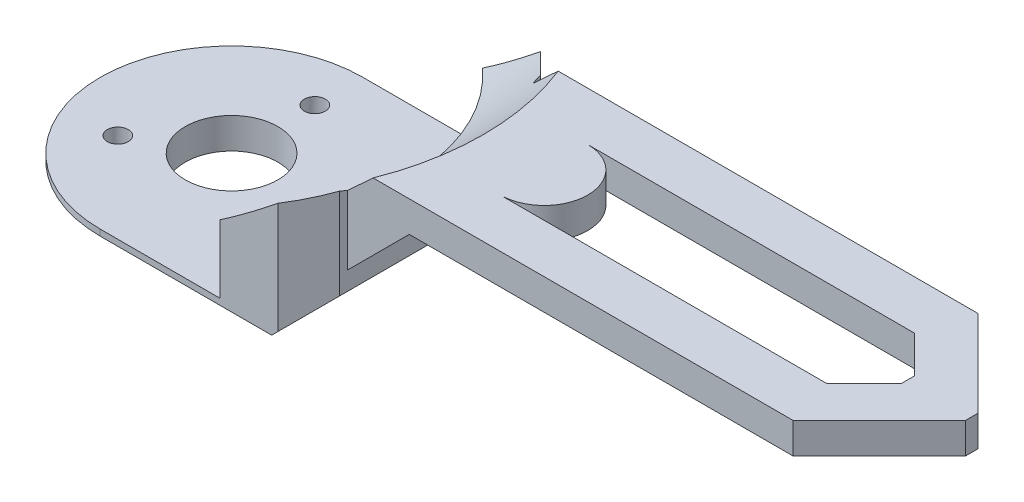
ISO-10303-21;
HEADER;
FILE_DESCRIPTION(('STEP AP214'),'2;1');
FILE_NAME('part.step','',(''),(''),'','','');
FILE_SCHEMA(('AUTOMOTIVE_DESIGN { 1 0 10303 214 1 1 1 1 }'));
ENDSEC;
DATA;
#1=APPLICATION_CONTEXT('core data for automotive mechanical design processes');
#2=APPLICATION_PROTOCOL_DEFINITION('international standard','automotive_design',2000,#1);
#3=PRODUCT_CONTEXT('',#1,'mechanical');
#4=PRODUCT('Part','Part','',(#3));
#5=PRODUCT_RELATED_PRODUCT_CATEGORY('part','',(#4));
#6=PRODUCT_DEFINITION_FORMATION('','',#4);
#7=PRODUCT_DEFINITION_CONTEXT('part definition',#1,'design');
#8=PRODUCT_DEFINITION('design','',#6,#7);
#9=PRODUCT_DEFINITION_SHAPE('','',#8);
#10=(LENGTH_UNIT() NAMED_UNIT(*) SI_UNIT(.MILLI.,.METRE.));
#11=(NAMED_UNIT(*) PLANE_ANGLE_UNIT() SI_UNIT($,.RADIAN.));
#12=(NAMED_UNIT(*) SI_UNIT($,.STERADIAN.) SOLID_ANGLE_UNIT());
#13=UNCERTAINTY_MEASURE_WITH_UNIT(LENGTH_MEASURE(1.E-05),#10,'distance_accuracy_value','');
#14=(GEOMETRIC_REPRESENTATION_CONTEXT(3) GLOBAL_UNCERTAINTY_ASSIGNED_CONTEXT((#13)) GLOBAL_UNIT_ASSIGNED_CONTEXT((#10,
#11,#12)) REPRESENTATION_CONTEXT('',''));
#15=CARTESIAN_POINT('',(0.,0.,0.));
#16=DIRECTION('',(0.,0.,1.));
#17=DIRECTION('',(1.,0.,0.));
#18=AXIS2_PLACEMENT_3D('',#15,#16,#17);
#19=CARTESIAN_POINT('',(33.8,5.,-21.3));
#20=DIRECTION('',(-1.,0.,0.));
#21=DIRECTION('',(0.,0.,1.));
#22=AXIS2_PLACEMENT_3D('',#19,#20,#21);
#23=PLANE('',#22);
#24=CARTESIAN_POINT('',(33.8,24.1789129099275,15.));
#25=CARTESIAN_POINT('',(33.8,24.3973295348672,15.5384090427307));
#26=CARTESIAN_POINT('',(33.8,24.6241329483371,16.0733646535301));
#27=CARTESIAN_POINT('',(33.8,25.0927755995893,17.1362230111643));
#28=CARTESIAN_POINT('',(33.8,25.3346045241524,17.6641302999805));
#29=CARTESIAN_POINT('',(33.8,25.8318402615375,18.7134320844225));
#30=CARTESIAN_POINT('',(33.8,26.0872459221836,19.2348271280804));
#31=CARTESIAN_POINT('',(33.8,26.6104771277259,20.2717980670367));
#32=CARTESIAN_POINT('',(33.8,26.8783109907833,20.7873697692283));
#33=CARTESIAN_POINT('',(33.8000000000001,27.1515957128123,21.3));
#34=B_SPLINE_CURVE_WITH_KNOTS('',3,(#24,#25,#26,#27,#28,#29,#30,#31,#32,#33),.UNSPECIFIED.,.F.,
.F.,(4,2,2,2,4),(0.,1.74293635285607,3.48468932815153,5.22629472660163,6.96908308081715),.UNSPECIFIED.);
#35=CARTESIAN_POINT('',(33.8,24.1789129099275,15.));
#36=VERTEX_POINT('',#35);
#37=CARTESIAN_POINT('',(33.8,24.7250582944251,16.3));
#38=VERTEX_POINT('',#37);
#39=EDGE_CURVE('E464',#36,#38,#34,.T.);
#40=ORIENTED_EDGE('',*,*,#39,.T.);
#41=DIRECTION('',(0.,-1.,0.));
#42=VECTOR('',#41,1.);
#43=CARTESIAN_POINT('',(33.8,4.99999999999999,16.3));
#44=LINE('',#43,#42);
#45=CARTESIAN_POINT('',(33.8,10.,16.3));
#46=VERTEX_POINT('',#45);
#47=EDGE_CURVE('E399',#38,#46,#44,.T.);
#48=ORIENTED_EDGE('',*,*,#47,.T.);
#49=DIRECTION('',(0.,0.,-1.));
#50=VECTOR('',#49,1.);
#51=CARTESIAN_POINT('',(33.8,10.,-21.3));
#52=LINE('',#51,#50);
#53=CARTESIAN_POINT('',(33.8,10.,-16.3));
#54=VERTEX_POINT('',#53);
#55=EDGE_CURVE('E321',#46,#54,#52,.T.);
#56=ORIENTED_EDGE('',*,*,#55,.T.);
#57=DIRECTION('',(0.,1.,0.));
#58=VECTOR('',#57,1.);
#59=CARTESIAN_POINT('',(33.8,5.,-16.3));
#60=LINE('',#59,#58);
#61=CARTESIAN_POINT('',(33.8,24.7250582944251,-16.3));
#62=VERTEX_POINT('',#61);
#63=EDGE_CURVE('E391',#54,#62,#60,.T.);
#64=ORIENTED_EDGE('',*,*,#63,.T.);
#65=CARTESIAN_POINT('',(33.8,27.1515957128123,-21.3));
#66=CARTESIAN_POINT('',(33.8,26.8783109907833,-20.7873697692283));
#67=CARTESIAN_POINT('',(33.8,26.6104771277259,-20.2717980670367));
#68=CARTESIAN_POINT('',(33.8,26.0872459221836,-19.2348271280805));
#69=CARTESIAN_POINT('',(33.8,25.8318402615375,-18.7134320844226));
#70=CARTESIAN_POINT('',(33.8,25.3346045241524,-17.6641302999805));
#71=CARTESIAN_POINT('',(33.8,25.0927755995893,-17.1362230111643));
#72=CARTESIAN_POINT('',(33.8,24.6241329483371,-16.0733646535302));
#73=CARTESIAN_POINT('',(33.8,24.3973295348672,-15.5384090427308));
#74=CARTESIAN_POINT('',(33.8,24.1789129099275,-15.));
#75=B_SPLINE_CURVE_WITH_KNOTS('',3,(#65,#66,#67,#68,#69,#70,#71,#72,#73,#74),.UNSPECIFIED.,.F.,
.F.,(4,2,2,2,4),(0.,1.74278835421552,3.48439375266562,5.22614672796108,6.96908308081715),.UNSPECIFIED.);
#76=CARTESIAN_POINT('',(33.8,24.1789129099275,-15.));
#77=VERTEX_POINT('',#76);
#78=EDGE_CURVE('E360',#62,#77,#75,.T.);
#79=ORIENTED_EDGE('',*,*,#78,.T.);
#80=DIRECTION('',(0.,1.,0.));
#81=VECTOR('',#80,1.);
#82=CARTESIAN_POINT('',(33.8,28.,-15.));
#83=LINE('',#82,#81);
#84=CARTESIAN_POINT('',(33.8,13.,-15.));
#85=VERTEX_POINT('',#84);
#86=EDGE_CURVE('E231',#85,#77,#83,.T.);
#87=ORIENTED_EDGE('',*,*,#86,.F.);
#88=DIRECTION('',(0.,0.,1.));
#89=VECTOR('',#88,1.);
#90=CARTESIAN_POINT('',(33.8,13.,15.));
#91=LINE('',#90,#89);
#92=CARTESIAN_POINT('',(33.8,13.,15.));
#93=VERTEX_POINT('',#92);
#94=EDGE_CURVE('E312',#85,#93,#91,.T.);
#95=ORIENTED_EDGE('',*,*,#94,.T.);
#96=DIRECTION('',(0.,-1.,0.));
#97=VECTOR('',#96,1.);
#98=CARTESIAN_POINT('',(33.8,28.,15.));
#99=LINE('',#98,#97);
#100=EDGE_CURVE('E250',#36,#93,#99,.T.);
#101=ORIENTED_EDGE('',*,*,#100,.F.);
#102=EDGE_LOOP('',(#40,#48,#56,#64,#79,#87,#95,#101));
#103=FACE_BOUND('',#102,.T.);
#104=ADVANCED_FACE('F42',(#103),#23,.F.);
#105=CARTESIAN_POINT('',(0.,5.,0.));
#106=DIRECTION('',(0.,1.,0.));
#107=DIRECTION('',(0.,0.,1.));
#108=AXIS2_PLACEMENT_3D('',#105,#106,#107);
#109=PLANE('',#108);
#110=CARTESIAN_POINT('',(-11.6913429510895,5.00000000000002,6.75000000000021));
#111=DIRECTION('',(0.,1.,0.));
#112=DIRECTION('',(0.,0.,1.));
#113=AXIS2_PLACEMENT_3D('',#110,#111,#112);
#114=CIRCLE('',#113,1.7);
#115=CARTESIAN_POINT('',(-11.6913429510895,5.00000000000002,8.45000000000021));
#116=VERTEX_POINT('',#115);
#117=EDGE_CURVE('E274',#116,#116,#114,.T.);
#118=ORIENTED_EDGE('',*,*,#117,.F.);
#119=EDGE_LOOP('',(#118));
#120=FACE_BOUND('',#119,.T.);
#121=CARTESIAN_POINT('',(0.,5.,-13.5));
#122=DIRECTION('',(0.,1.,0.));
#123=DIRECTION('',(0.,0.,1.));
#124=AXIS2_PLACEMENT_3D('',#121,#122,#123);
#125=CIRCLE('',#124,1.7);
#126=CARTESIAN_POINT('',(0.,5.,-11.8));
#127=VERTEX_POINT('',#126);
#128=EDGE_CURVE('E286',#127,#127,#125,.T.);
#129=ORIENTED_EDGE('',*,*,#128,.F.);
#130=EDGE_LOOP('',(#129));
#131=FACE_BOUND('',#130,.T.);
#132=CARTESIAN_POINT('',(0.,5.,0.));
#133=DIRECTION('',(0.,1.,0.));
#134=DIRECTION('',(0.,0.,1.));
#135=AXIS2_PLACEMENT_3D('',#132,#133,#134);
#136=CIRCLE('',#135,7.5);
#137=CARTESIAN_POINT('',(0.,5.,7.5));
#138=VERTEX_POINT('',#137);
#139=EDGE_CURVE('E292',#138,#138,#136,.T.);
#140=ORIENTED_EDGE('',*,*,#139,.F.);
#141=EDGE_LOOP('',(#140));
#142=FACE_BOUND('',#141,.T.);
#143=CARTESIAN_POINT('',(11.6913429510903,4.99999999999999,6.74999999999976));
#144=DIRECTION('',(0.,1.,0.));
#145=DIRECTION('',(0.,0.,1.));
#146=AXIS2_PLACEMENT_3D('',#143,#144,#145);
#147=CIRCLE('',#146,1.7);
#148=CARTESIAN_POINT('',(11.6913429510903,4.99999999999999,8.44999999999976));
#149=VERTEX_POINT('',#148);
#150=EDGE_CURVE('E280',#149,#149,#147,.T.);
#151=ORIENTED_EDGE('',*,*,#150,.F.);
#152=EDGE_LOOP('',(#151));
#153=FACE_BOUND('',#152,.T.);
#154=CARTESIAN_POINT('',(0.,5.,0.));
#155=DIRECTION('',(0.,-1.,0.));
#156=DIRECTION('',(0.,0.,1.));
#157=AXIS2_PLACEMENT_3D('',#154,#155,#156);
#158=CIRCLE('',#157,28.8);
#159=CARTESIAN_POINT('',(19.3842719749801,5.,-21.3));
#160=VERTEX_POINT('',#159);
#161=CARTESIAN_POINT('',(19.3842719749801,4.99999999999999,21.3));
#162=VERTEX_POINT('',#161);
#163=EDGE_CURVE('E266',#160,#162,#158,.T.);
#164=ORIENTED_EDGE('',*,*,#163,.F.);
#165=DIRECTION('',(-1.,0.,0.));
#166=VECTOR('',#165,1.);
#167=CARTESIAN_POINT('',(28.8,4.99999999999999,-21.3));
#168=LINE('',#167,#166);
#169=CARTESIAN_POINT('',(0.,4.99999999999999,-21.3));
#170=VERTEX_POINT('',#169);
#171=EDGE_CURVE('E300',#160,#170,#168,.T.);
#172=ORIENTED_EDGE('',*,*,#171,.T.);
#173=CARTESIAN_POINT('',(0.,5.,0.));
#174=DIRECTION('',(0.,1.,0.));
#175=DIRECTION('',(0.,0.,1.));
#176=AXIS2_PLACEMENT_3D('',#173,#174,#175);
#177=CIRCLE('',#176,21.3);
#178=CARTESIAN_POINT('',(0.,5.,21.3));
#179=VERTEX_POINT('',#178);
#180=EDGE_CURVE('E302',#170,#179,#177,.T.);
#181=ORIENTED_EDGE('',*,*,#180,.T.);
#182=DIRECTION('',(1.,0.,0.));
#183=VECTOR('',#182,1.);
#184=CARTESIAN_POINT('',(28.8,5.,21.3));
#185=LINE('',#184,#183);
#186=EDGE_CURVE('E295',#179,#162,#185,.T.);
#187=ORIENTED_EDGE('',*,*,#186,.T.);
#188=EDGE_LOOP('',(#164,#172,#181,#187));
#189=FACE_BOUND('',#188,.T.);
#190=ADVANCED_FACE('F447',(#120,#131,#142,#153,#189),#109,.T.);
#191=CARTESIAN_POINT('',(0.,0.,0.));
#192=DIRECTION('',(0.,1.,0.));
#193=DIRECTION('',(0.,0.,1.));
#194=AXIS2_PLACEMENT_3D('',#191,#192,#193);
#195=PLANE('',#194);
#196=CARTESIAN_POINT('',(0.,0.,0.));
#197=DIRECTION('',(0.,1.,0.));
#198=DIRECTION('',(0.,0.,1.));
#199=AXIS2_PLACEMENT_3D('',#196,#197,#198);
#200=CIRCLE('',#199,17.3);
#201=CARTESIAN_POINT('',(0.,0.,17.3));
#202=VERTEX_POINT('',#201);
#203=CARTESIAN_POINT('',(0.,0.,-17.3));
#204=VERTEX_POINT('',#203);
#205=EDGE_CURVE('E496',#202,#204,#200,.F.);
#206=ORIENTED_EDGE('',*,*,#205,.T.);
#207=DIRECTION('',(1.,0.,0.));
#208=VECTOR('',#207,1.);
#209=CARTESIAN_POINT('',(0.,0.,-17.3));
#210=LINE('',#209,#208);
#211=CARTESIAN_POINT('',(23.8,0.,-17.3));
#212=VERTEX_POINT('',#211);
#213=EDGE_CURVE('E506',#204,#212,#210,.T.);
#214=ORIENTED_EDGE('',*,*,#213,.T.);
#215=DIRECTION('',(0.,0.,1.));
#216=VECTOR('',#215,1.);
#217=CARTESIAN_POINT('',(23.8,0.,0.));
#218=LINE('',#217,#216);
#219=CARTESIAN_POINT('',(23.8,0.,17.3));
#220=VERTEX_POINT('',#219);
#221=EDGE_CURVE('E327',#212,#220,#218,.T.);
#222=ORIENTED_EDGE('',*,*,#221,.T.);
#223=DIRECTION('',(-1.,0.,0.));
#224=VECTOR('',#223,1.);
#225=CARTESIAN_POINT('',(0.,0.,17.3));
#226=LINE('',#225,#224);
#227=EDGE_CURVE('E499',#220,#202,#226,.T.);
#228=ORIENTED_EDGE('',*,*,#227,.T.);
#229=EDGE_LOOP('',(#206,#214,#222,#228));
#230=FACE_BOUND('',#229,.T.);
#231=CARTESIAN_POINT('',(0.,0.,0.));
#232=DIRECTION('',(0.,1.,0.));
#233=DIRECTION('',(0.,0.,1.));
#234=AXIS2_PLACEMENT_3D('',#231,#232,#233);
#235=CIRCLE('',#234,7.5);
#236=CARTESIAN_POINT('',(0.,0.,7.5));
#237=VERTEX_POINT('',#236);
#238=EDGE_CURVE('E289',#237,#237,#235,.T.);
#239=ORIENTED_EDGE('',*,*,#238,.T.);
#240=EDGE_LOOP('',(#239));
#241=FACE_BOUND('',#240,.T.);
#242=CARTESIAN_POINT('',(0.,0.,-13.5));
#243=DIRECTION('',(0.,1.,0.));
#244=DIRECTION('',(0.,0.,1.));
#245=AXIS2_PLACEMENT_3D('',#242,#243,#244);
#246=CIRCLE('',#245,1.7);
#247=CARTESIAN_POINT('',(0.,0.,-11.8));
#248=VERTEX_POINT('',#247);
#249=EDGE_CURVE('E283',#248,#248,#246,.T.);
#250=ORIENTED_EDGE('',*,*,#249,.T.);
#251=EDGE_LOOP('',(#250));
#252=FACE_BOUND('',#251,.T.);
#253=CARTESIAN_POINT('',(11.6913429510903,0.,6.74999999999976));
#254=DIRECTION('',(0.,1.,0.));
#255=DIRECTION('',(0.,0.,1.));
#256=AXIS2_PLACEMENT_3D('',#253,#254,#255);
#257=CIRCLE('',#256,1.7);
#258=CARTESIAN_POINT('',(11.6913429510903,0.,8.44999999999976));
#259=VERTEX_POINT('',#258);
#260=EDGE_CURVE('E277',#259,#259,#257,.T.);
#261=ORIENTED_EDGE('',*,*,#260,.T.);
#262=EDGE_LOOP('',(#261));
#263=FACE_BOUND('',#262,.T.);
#264=CARTESIAN_POINT('',(-11.6913429510895,0.,6.75000000000023));
#265=DIRECTION('',(0.,1.,0.));
#266=DIRECTION('',(0.,0.,1.));
#267=AXIS2_PLACEMENT_3D('',#264,#265,#266);
#268=CIRCLE('',#267,1.7);
#269=CARTESIAN_POINT('',(-11.6913429510895,0.,8.45000000000023));
#270=VERTEX_POINT('',#269);
#271=EDGE_CURVE('E273',#270,#270,#268,.T.);
#272=ORIENTED_EDGE('',*,*,#271,.T.);
#273=EDGE_LOOP('',(#272));
#274=FACE_BOUND('',#273,.T.);
#275=ADVANCED_FACE('F452',(#230,#241,#252,#263,#274),#195,.F.);
#276=CARTESIAN_POINT('',(0.,4.99999999999999,-21.3));
#277=DIRECTION('',(0.,0.,1.));
#278=DIRECTION('',(1.,0.,0.));
#279=AXIS2_PLACEMENT_3D('',#276,#277,#278);
#280=PLANE('',#279);
#281=DIRECTION('',(0.707106781186549,0.707106781186547,0.));
#282=VECTOR('',#281,1.);
#283=CARTESIAN_POINT('',(33.8,10.,-21.3));
#284=LINE('',#283,#282);
#285=CARTESIAN_POINT('',(28.8,4.99999999999999,-21.3));
#286=VERTEX_POINT('',#285);
#287=CARTESIAN_POINT('',(27.8,3.99999999999999,-21.3));
#288=VERTEX_POINT('',#287);
#289=EDGE_CURVE('E324',#286,#288,#284,.F.);
#290=ORIENTED_EDGE('',*,*,#289,.T.);
#291=DIRECTION('',(-1.,0.,0.));
#292=VECTOR('',#291,1.);
#293=CARTESIAN_POINT('',(0.,3.99999999999999,-21.3));
#294=LINE('',#293,#292);
#295=CARTESIAN_POINT('',(0.,3.99999999999999,-21.3));
#296=VERTEX_POINT('',#295);
#297=EDGE_CURVE('E492',#288,#296,#294,.T.);
#298=ORIENTED_EDGE('',*,*,#297,.T.);
#299=DIRECTION('',(0.,-1.,0.));
#300=VECTOR('',#299,1.);
#301=CARTESIAN_POINT('',(0.,4.99999999999999,-21.3));
#302=LINE('',#301,#300);
#303=EDGE_CURVE('E307',#170,#296,#302,.T.);
#304=ORIENTED_EDGE('',*,*,#303,.F.);
#305=ORIENTED_EDGE('',*,*,#171,.F.);
#306=DIRECTION('',(0.,-1.,0.));
#307=VECTOR('',#306,1.);
#308=CARTESIAN_POINT('',(19.3842719749801,28.,-21.3));
#309=LINE('',#308,#307);
#310=CARTESIAN_POINT('',(19.3842719749801,16.,-21.3));
#311=VERTEX_POINT('',#310);
#312=EDGE_CURVE('E271',#311,#160,#309,.T.);
#313=ORIENTED_EDGE('',*,*,#312,.F.);
#314=CARTESIAN_POINT('',(19.3842719749801,16.,-21.3));
#315=CARTESIAN_POINT('',(19.6996216045867,16.2122580422859,-21.3));
#316=CARTESIAN_POINT('',(20.0136604294313,16.4264516096833,-21.3));
#317=CARTESIAN_POINT('',(20.6392891292529,16.8583707796529,-21.3));
#318=CARTESIAN_POINT('',(20.9508790643746,17.0760962950757,-21.3));
#319=CARTESIAN_POINT('',(21.8821754708669,17.7340200064673,-21.3));
#320=CARTESIAN_POINT('',(22.4984919859796,18.1790217730872,-21.3));
#321=CARTESIAN_POINT('',(23.7228637497754,19.0793406445304,-21.3));
#322=CARTESIAN_POINT('',(24.330924407669,19.5346504164171,-21.3));
#323=CARTESIAN_POINT('',(25.5402818206515,20.454199326859,-21.3));
#324=CARTESIAN_POINT('',(26.1415783324999,20.9184387849117,-21.3));
#325=CARTESIAN_POINT('',(27.3380475555775,21.8542925126413,-21.3));
#326=CARTESIAN_POINT('',(27.9332223914444,22.3259040699335,-21.3));
#327=CARTESIAN_POINT('',(29.11840665036,23.2755592318968,-21.3));
#328=CARTESIAN_POINT('',(29.7084161077802,23.7536027937143,-21.3));
#329=CARTESIAN_POINT('',(30.8843256666674,24.7155564796288,-21.3));
#330=CARTESIAN_POINT('',(31.4702225608608,25.1994705198288,-21.3));
#331=CARTESIAN_POINT('',(32.6379942383695,26.1721051502294,-21.3));
#332=CARTESIAN_POINT('',(33.2198691041151,26.6608256414229,-21.3));
#333=CARTESIAN_POINT('',(33.8,27.1515957128123,-21.3));
#334=B_SPLINE_CURVE_WITH_KNOTS('',3,(#314,#315,#316,#317,#318,#319,#320,#321,#322,#323,#324,
#325,#326,#327,#328,#329,#330,#331,#332,#333),.UNSPECIFIED.,.F.,.F.,(4,2,2,2,2,2,2,2,2,4),(0.,
1.14037228447727,2.28071647338667,4.56110275881133,6.83991484997627,9.11880862754832,
11.3968828053011,13.6749418127274,15.9546146529165,18.2342406324792),.UNSPECIFIED.);
#335=CARTESIAN_POINT('',(28.7999999999945,23.0208040110727,-21.3));
#336=VERTEX_POINT('',#335);
#337=EDGE_CURVE('E392',#311,#336,#334,.T.);
#338=ORIENTED_EDGE('',*,*,#337,.T.);
#339=DIRECTION('',(0.,-1.,0.));
#340=VECTOR('',#339,1.);
#341=CARTESIAN_POINT('',(28.8,4.99999999999999,-21.3));
#342=LINE('',#341,#340);
#343=EDGE_CURVE('E572',#336,#286,#342,.T.);
#344=ORIENTED_EDGE('',*,*,#343,.T.);
#345=EDGE_LOOP('',(#290,#298,#304,#305,#313,#338,#344));
#346=FACE_BOUND('',#345,.T.);
#347=ADVANCED_FACE('F458',(#346),#280,.F.);
#348=CARTESIAN_POINT('',(0.,5.,0.));
#349=DIRECTION('',(0.,-1.,0.));
#350=DIRECTION('',(0.,0.,-1.));
#351=AXIS2_PLACEMENT_3D('',#348,#349,#350);
#352=CYLINDRICAL_SURFACE('',#351,21.3);
#353=ORIENTED_EDGE('',*,*,#303,.T.);
#354=CARTESIAN_POINT('',(0.,3.99999999999999,0.));
#355=DIRECTION('',(0.,1.,0.));
#356=DIRECTION('',(0.,0.,1.));
#357=AXIS2_PLACEMENT_3D('',#354,#355,#356);
#358=CIRCLE('',#357,21.3);
#359=CARTESIAN_POINT('',(0.,3.99999999999999,21.3));
#360=VERTEX_POINT('',#359);
#361=EDGE_CURVE('E11',#296,#360,#358,.T.);
#362=ORIENTED_EDGE('',*,*,#361,.T.);
#363=DIRECTION('',(0.,-1.,0.));
#364=VECTOR('',#363,1.);
#365=CARTESIAN_POINT('',(0.,5.,21.3));
#366=LINE('',#365,#364);
#367=EDGE_CURVE('E305',#179,#360,#366,.T.);
#368=ORIENTED_EDGE('',*,*,#367,.F.);
#369=ORIENTED_EDGE('',*,*,#180,.F.);
#370=EDGE_LOOP('',(#353,#362,#368,#369));
#371=FACE_BOUND('',#370,.T.);
#372=ADVANCED_FACE('F480',(#371),#352,.T.);
#373=CARTESIAN_POINT('',(0.,5.,21.3));
#374=DIRECTION('',(0.,0.,-1.));
#375=DIRECTION('',(-1.,0.,0.));
#376=AXIS2_PLACEMENT_3D('',#373,#374,#375);
#377=PLANE('',#376);
#378=ORIENTED_EDGE('',*,*,#367,.T.);
#379=DIRECTION('',(1.,0.,0.));
#380=VECTOR('',#379,1.);
#381=CARTESIAN_POINT('',(0.,3.99999999999999,21.3));
#382=LINE('',#381,#380);
#383=CARTESIAN_POINT('',(27.8,3.99999999999999,21.3));
#384=VERTEX_POINT('',#383);
#385=EDGE_CURVE('E51',#360,#384,#382,.T.);
#386=ORIENTED_EDGE('',*,*,#385,.T.);
#387=DIRECTION('',(-0.707106781186549,-0.707106781186547,0.));
#388=VECTOR('',#387,1.);
#389=CARTESIAN_POINT('',(33.8,9.99999999999999,21.3));
#390=LINE('',#389,#388);
#391=CARTESIAN_POINT('',(28.8,5.00000000000002,21.3));
#392=VERTEX_POINT('',#391);
#393=EDGE_CURVE('E330',#384,#392,#390,.F.);
#394=ORIENTED_EDGE('',*,*,#393,.T.);
#395=DIRECTION('',(0.,1.,0.));
#396=VECTOR('',#395,1.);
#397=CARTESIAN_POINT('',(28.8,5.,21.3));
#398=LINE('',#397,#396);
#399=CARTESIAN_POINT('',(28.8,23.0208040110772,21.3));
#400=VERTEX_POINT('',#399);
#401=EDGE_CURVE('E407',#392,#400,#398,.T.);
#402=ORIENTED_EDGE('',*,*,#401,.T.);
#403=CARTESIAN_POINT('',(33.8000000000001,27.1515957128123,21.3));
#404=CARTESIAN_POINT('',(33.2198691041151,26.6608256414229,21.3));
#405=CARTESIAN_POINT('',(32.6379942383695,26.1721051502295,21.3));
#406=CARTESIAN_POINT('',(31.4702225608608,25.1994705198288,21.3));
#407=CARTESIAN_POINT('',(30.8843256666675,24.7155564796288,21.3));
#408=CARTESIAN_POINT('',(29.7084161077802,23.7536027937143,21.3));
#409=CARTESIAN_POINT('',(29.11840665036,23.2755592318968,21.3));
#410=CARTESIAN_POINT('',(27.9332223914444,22.3259040699335,21.3));
#411=CARTESIAN_POINT('',(27.3380475555776,21.8542925126414,21.3));
#412=CARTESIAN_POINT('',(26.1415783324999,20.9184387849117,21.3));
#413=CARTESIAN_POINT('',(25.5402818206515,20.454199326859,21.3));
#414=CARTESIAN_POINT('',(24.330924407669,19.5346504164171,21.3));
#415=CARTESIAN_POINT('',(23.7228637497754,19.0793406445304,21.3));
#416=CARTESIAN_POINT('',(22.4984919859796,18.1790217730872,21.3));
#417=CARTESIAN_POINT('',(21.8821754708669,17.7340200064673,21.3));
#418=CARTESIAN_POINT('',(20.9508790643746,17.0760962950757,21.3));
#419=CARTESIAN_POINT('',(20.6392891292529,16.8583707796529,21.3));
#420=CARTESIAN_POINT('',(20.0136604294313,16.4264516096834,21.3));
#421=CARTESIAN_POINT('',(19.6996216045867,16.2122580422859,21.3));
#422=CARTESIAN_POINT('',(19.3842719749801,16.,21.3));
#423=B_SPLINE_CURVE_WITH_KNOTS('',3,(#403,#404,#405,#406,#407,#408,#409,#410,#411,#412,#413,
#414,#415,#416,#417,#418,#419,#420,#421,#422),.UNSPECIFIED.,.F.,.F.,(4,2,2,2,2,2,2,2,2,4),(0.,
2.27962597956271,4.55929881975175,6.83735782717811,9.11543200493087,11.3943257825029,
13.6731378736679,15.9535241590925,17.0938683480019,18.2342406324792),.UNSPECIFIED.);
#424=CARTESIAN_POINT('',(19.3842719749801,16.,21.3));
#425=VERTEX_POINT('',#424);
#426=EDGE_CURVE('E469',#400,#425,#423,.T.);
#427=ORIENTED_EDGE('',*,*,#426,.T.);
#428=DIRECTION('',(0.,-1.,0.));
#429=VECTOR('',#428,1.);
#430=CARTESIAN_POINT('',(19.3842719749801,28.,21.3));
#431=LINE('',#430,#429);
#432=EDGE_CURVE('E269',#425,#162,#431,.T.);
#433=ORIENTED_EDGE('',*,*,#432,.T.);
#434=ORIENTED_EDGE('',*,*,#186,.F.);
#435=EDGE_LOOP('',(#378,#386,#394,#402,#427,#433,#434));
#436=FACE_BOUND('',#435,.T.);
#437=ADVANCED_FACE('F475',(#436),#377,.F.);
#438=CARTESIAN_POINT('',(0.,5.,0.));
#439=DIRECTION('',(0.,-1.,0.));
#440=DIRECTION('',(0.,0.,-1.));
#441=AXIS2_PLACEMENT_3D('',#438,#439,#440);
#442=CYLINDRICAL_SURFACE('',#441,7.5);
#443=ORIENTED_EDGE('',*,*,#139,.T.);
#444=EDGE_LOOP('',(#443));
#445=FACE_BOUND('',#444,.T.);
#446=ORIENTED_EDGE('',*,*,#238,.F.);
#447=EDGE_LOOP('',(#446));
#448=FACE_BOUND('',#447,.T.);
#449=ADVANCED_FACE('F479',(#445,#448),#442,.F.);
#450=CARTESIAN_POINT('',(0.,5.,-13.5));
#451=DIRECTION('',(0.,-1.,0.));
#452=DIRECTION('',(0.,0.,-1.));
#453=AXIS2_PLACEMENT_3D('',#450,#451,#452);
#454=CYLINDRICAL_SURFACE('',#453,1.7);
#455=ORIENTED_EDGE('',*,*,#128,.T.);
#456=EDGE_LOOP('',(#455));
#457=FACE_BOUND('',#456,.T.);
#458=ORIENTED_EDGE('',*,*,#249,.F.);
#459=EDGE_LOOP('',(#458));
#460=FACE_BOUND('',#459,.T.);
#461=ADVANCED_FACE('F543',(#457,#460),#454,.F.);
#462=CARTESIAN_POINT('',(11.6913429510903,4.99999999999999,6.74999999999976));
#463=DIRECTION('',(0.,-1.,0.));
#464=DIRECTION('',(0.,0.,-1.));
#465=AXIS2_PLACEMENT_3D('',#462,#463,#464);
#466=CYLINDRICAL_SURFACE('',#465,1.7);
#467=ORIENTED_EDGE('',*,*,#150,.T.);
#468=EDGE_LOOP('',(#467));
#469=FACE_BOUND('',#468,.T.);
#470=ORIENTED_EDGE('',*,*,#260,.F.);
#471=EDGE_LOOP('',(#470));
#472=FACE_BOUND('',#471,.T.);
#473=ADVANCED_FACE('F535',(#469,#472),#466,.F.);
#474=CARTESIAN_POINT('',(-11.6913429510895,5.00000000000002,6.75000000000021));
#475=DIRECTION('',(0.,-1.,0.));
#476=DIRECTION('',(0.,0.,-1.));
#477=AXIS2_PLACEMENT_3D('',#474,#475,#476);
#478=CYLINDRICAL_SURFACE('',#477,1.7);
#479=ORIENTED_EDGE('',*,*,#117,.T.);
#480=EDGE_LOOP('',(#479));
#481=FACE_BOUND('',#480,.T.);
#482=ORIENTED_EDGE('',*,*,#271,.F.);
#483=EDGE_LOOP('',(#482));
#484=FACE_BOUND('',#483,.T.);
#485=ADVANCED_FACE('F532',(#481,#484),#478,.F.);
#486=CARTESIAN_POINT('',(0.,28.,0.));
#487=DIRECTION('',(0.,-1.,0.));
#488=DIRECTION('',(0.,0.,-1.));
#489=AXIS2_PLACEMENT_3D('',#486,#487,#488);
#490=CYLINDRICAL_SURFACE('',#489,28.8);
#491=ORIENTED_EDGE('',*,*,#432,.F.);
#492=CARTESIAN_POINT('',(0.,16.,0.));
#493=DIRECTION('',(0.,1.,0.));
#494=DIRECTION('',(0.,0.,1.));
#495=AXIS2_PLACEMENT_3D('',#492,#493,#494);
#496=CIRCLE('',#495,28.8);
#497=EDGE_CURVE('E474',#425,#311,#496,.T.);
#498=ORIENTED_EDGE('',*,*,#497,.T.);
#499=ORIENTED_EDGE('',*,*,#312,.T.);
#500=ORIENTED_EDGE('',*,*,#163,.T.);
#501=EDGE_LOOP('',(#491,#498,#499,#500));
#502=FACE_BOUND('',#501,.T.);
#503=ADVANCED_FACE('F534',(#502),#490,.F.);
#504=CARTESIAN_POINT('',(0.,28.,0.));
#505=DIRECTION('',(0.,1.,0.));
#506=DIRECTION('',(0.,0.,1.));
#507=AXIS2_PLACEMENT_3D('',#504,#505,#506);
#508=PLANE('',#507);
#509=CARTESIAN_POINT('',(50.652646896029,28.,0.));
#510=DIRECTION('',(0.,-1.,0.));
#511=DIRECTION('',(0.,0.,1.));
#512=AXIS2_PLACEMENT_3D('',#509,#510,#511);
#513=CIRCLE('',#512,7.09110262480493);
#514=CARTESIAN_POINT('',(50.652646896029,28.,-7.09110262480493));
#515=VERTEX_POINT('',#514);
#516=CARTESIAN_POINT('',(50.652646896029,28.,7.09110262480493));
#517=VERTEX_POINT('',#516);
#518=EDGE_CURVE('E227',#515,#517,#513,.T.);
#519=ORIENTED_EDGE('',*,*,#518,.F.);
#520=DIRECTION('',(-1.,0.,0.));
#521=VECTOR('',#520,1.);
#522=CARTESIAN_POINT('',(50.652646896029,28.,-7.09110262480493));
#523=LINE('',#522,#521);
#524=CARTESIAN_POINT('',(103.617699283362,28.,-7.09110262480497));
#525=VERTEX_POINT('',#524);
#526=EDGE_CURVE('E211',#525,#515,#523,.T.);
#527=ORIENTED_EDGE('',*,*,#526,.F.);
#528=DIRECTION('',(-0.707106781186552,0.,-0.707106781186543));
#529=VECTOR('',#528,1.);
#530=CARTESIAN_POINT('',(103.617699283362,28.,-7.09110262480497));
#531=LINE('',#530,#529);
#532=CARTESIAN_POINT('',(109.617699283362,28.,-1.09110262480502));
#533=VERTEX_POINT('',#532);
#534=EDGE_CURVE('E501',#525,#533,#531,.F.);
#535=ORIENTED_EDGE('',*,*,#534,.T.);
#536=DIRECTION('',(0.,0.,-1.));
#537=VECTOR('',#536,1.);
#538=CARTESIAN_POINT('',(109.617699283362,28.,-7.09110262480497));
#539=LINE('',#538,#537);
#540=CARTESIAN_POINT('',(109.617699283362,28.,1.09110262480486));
#541=VERTEX_POINT('',#540);
#542=EDGE_CURVE('E221',#541,#533,#539,.T.);
#543=ORIENTED_EDGE('',*,*,#542,.F.);
#544=DIRECTION('',(0.707106781186543,0.,-0.707106781186552));
#545=VECTOR('',#544,1.);
#546=CARTESIAN_POINT('',(109.617699283362,28.,1.09110262480486));
#547=LINE('',#546,#545);
#548=CARTESIAN_POINT('',(103.617699283362,28.,7.09110262480494));
#549=VERTEX_POINT('',#548);
#550=EDGE_CURVE('E591',#541,#549,#547,.F.);
#551=ORIENTED_EDGE('',*,*,#550,.T.);
#552=DIRECTION('',(1.,0.,0.));
#553=VECTOR('',#552,1.);
#554=CARTESIAN_POINT('',(50.652646896029,28.,7.09110262480493));
#555=LINE('',#554,#553);
#556=EDGE_CURVE('E237',#517,#549,#555,.T.);
#557=ORIENTED_EDGE('',*,*,#556,.F.);
#558=EDGE_LOOP('',(#519,#527,#535,#543,#551,#557));
#559=FACE_BOUND('',#558,.T.);
#560=DIRECTION('',(-1.,0.,0.));
#561=VECTOR('',#560,1.);
#562=CARTESIAN_POINT('',(120.,28.,-15.));
#563=LINE('',#562,#561);
#564=CARTESIAN_POINT('',(106.,28.,-15.0000000000001));
#565=VERTEX_POINT('',#564);
#566=CARTESIAN_POINT('',(37.9425882090297,28.,-15.));
#567=VERTEX_POINT('',#566);
#568=EDGE_CURVE('E263',#565,#567,#563,.T.);
#569=ORIENTED_EDGE('',*,*,#568,.T.);
#570=CARTESIAN_POINT('',(0.,28.,0.));
#571=DIRECTION('',(0.,1.,0.));
#572=DIRECTION('',(0.,0.,1.));
#573=AXIS2_PLACEMENT_3D('',#570,#571,#572);
#574=CIRCLE('',#573,40.8);
#575=CARTESIAN_POINT('',(37.9425882090297,28.,15.));
#576=VERTEX_POINT('',#575);
#577=EDGE_CURVE('E350',#567,#576,#574,.F.);
#578=ORIENTED_EDGE('',*,*,#577,.T.);
#579=DIRECTION('',(-1.,0.,0.));
#580=VECTOR('',#579,1.);
#581=CARTESIAN_POINT('',(120.,28.,15.));
#582=LINE('',#581,#580);
#583=CARTESIAN_POINT('',(106.,28.,15.));
#584=VERTEX_POINT('',#583);
#585=EDGE_CURVE('E260',#584,#576,#582,.T.);
#586=ORIENTED_EDGE('',*,*,#585,.F.);
#587=DIRECTION('',(-0.707106781186549,0.,0.707106781186546));
#588=VECTOR('',#587,1.);
#589=CARTESIAN_POINT('',(60.4999999999998,28.,60.5));
#590=LINE('',#589,#588);
#591=CARTESIAN_POINT('',(120.,28.,1.));
#592=VERTEX_POINT('',#591);
#593=EDGE_CURVE('E346',#584,#592,#590,.F.);
#594=ORIENTED_EDGE('',*,*,#593,.T.);
#595=DIRECTION('',(0.,0.,1.));
#596=VECTOR('',#595,1.);
#597=CARTESIAN_POINT('',(120.,28.,-15.));
#598=LINE('',#597,#596);
#599=CARTESIAN_POINT('',(120.,28.,-1.00000000000003));
#600=VERTEX_POINT('',#599);
#601=EDGE_CURVE('E246',#600,#592,#598,.T.);
#602=ORIENTED_EDGE('',*,*,#601,.F.);
#603=DIRECTION('',(0.707106781186549,0.,0.707106781186546));
#604=VECTOR('',#603,1.);
#605=CARTESIAN_POINT('',(60.4999999999998,28.,-60.5));
#606=LINE('',#605,#604);
#607=EDGE_CURVE('E344',#600,#565,#606,.F.);
#608=ORIENTED_EDGE('',*,*,#607,.T.);
#609=EDGE_LOOP('',(#569,#578,#586,#594,#602,#608));
#610=FACE_BOUND('',#609,.T.);
#611=ADVANCED_FACE('F234',(#559,#610),#508,.T.);
#612=CARTESIAN_POINT('',(120.,28.,-15.));
#613=DIRECTION('',(0.,0.,1.));
#614=DIRECTION('',(1.,0.,0.));
#615=AXIS2_PLACEMENT_3D('',#612,#613,#614);
#616=PLANE('',#615);
#617=ORIENTED_EDGE('',*,*,#86,.T.);
#618=CARTESIAN_POINT('',(33.8,24.1789129099275,-15.));
#619=CARTESIAN_POINT('',(34.1466568530368,24.4957714517693,-15.));
#620=CARTESIAN_POINT('',(34.4929163695722,24.8130643735232,-15.));
#621=CARTESIAN_POINT('',(35.1846960477896,25.448452037501,-15.));
#622=CARTESIAN_POINT('',(35.5302162128756,25.7665467760187,-15.));
#623=CARTESIAN_POINT('',(36.2205754845145,26.4034738566279,-15.));
#624=CARTESIAN_POINT('',(36.5654145915007,26.72230619825,-15.));
#625=CARTESIAN_POINT('',(37.2544623975068,27.360654581762,-15.));
#626=CARTESIAN_POINT('',(37.5986710936116,27.6801706267987,-15.));
#627=CARTESIAN_POINT('',(37.9425882090297,28.,-15.));
#628=B_SPLINE_CURVE_WITH_KNOTS('',3,(#618,#619,#620,#621,#622,#623,#624,#625,#626,#627),
.UNSPECIFIED.,.F.,.F.,(4,2,2,2,4),(0.,1.4089467197004,2.81788693872171,4.22682626126935,
5.63577208274937),.UNSPECIFIED.);
#629=EDGE_CURVE('E385',#77,#567,#628,.T.);
#630=ORIENTED_EDGE('',*,*,#629,.T.);
#631=ORIENTED_EDGE('',*,*,#568,.F.);
#632=DIRECTION('',(0.,-1.,0.));
#633=VECTOR('',#632,1.);
#634=CARTESIAN_POINT('',(106.,28.,-15.0000000000001));
#635=LINE('',#634,#633);
#636=CARTESIAN_POINT('',(106.,23.,-15.0000000000001));
#637=VERTEX_POINT('',#636);
#638=EDGE_CURVE('E348',#565,#637,#635,.T.);
#639=ORIENTED_EDGE('',*,*,#638,.T.);
#640=DIRECTION('',(-1.,0.,0.));
#641=VECTOR('',#640,1.);
#642=CARTESIAN_POINT('',(120.,23.,-15.));
#643=LINE('',#642,#641);
#644=CARTESIAN_POINT('',(43.8000000000001,23.,-15.));
#645=VERTEX_POINT('',#644);
#646=EDGE_CURVE('E253',#637,#645,#643,.T.);
#647=ORIENTED_EDGE('',*,*,#646,.T.);
#648=DIRECTION('',(0.70710678118655,0.707106781186545,0.));
#649=VECTOR('',#648,1.);
#650=CARTESIAN_POINT('',(84.4000000000003,63.6,-15.));
#651=LINE('',#650,#649);
#652=EDGE_CURVE('E315',#645,#85,#651,.F.);
#653=ORIENTED_EDGE('',*,*,#652,.T.);
#654=EDGE_LOOP('',(#617,#630,#631,#639,#647,#653));
#655=FACE_BOUND('',#654,.T.);
#656=ADVANCED_FACE('F376',(#655),#616,.F.);
#657=CARTESIAN_POINT('',(120.,28.,15.));
#658=DIRECTION('',(0.,0.,-1.));
#659=DIRECTION('',(-1.,0.,0.));
#660=AXIS2_PLACEMENT_3D('',#657,#658,#659);
#661=PLANE('',#660);
#662=ORIENTED_EDGE('',*,*,#585,.T.);
#663=CARTESIAN_POINT('',(37.9425882090297,28.,15.));
#664=CARTESIAN_POINT('',(37.5986710936116,27.6801706267987,15.));
#665=CARTESIAN_POINT('',(37.2544623975068,27.3606545817619,15.));
#666=CARTESIAN_POINT('',(36.5654145915007,26.72230619825,15.));
#667=CARTESIAN_POINT('',(36.2205754845145,26.4034738566279,15.));
#668=CARTESIAN_POINT('',(35.5302162128756,25.7665467760187,15.));
#669=CARTESIAN_POINT('',(35.1846960477896,25.448452037501,15.));
#670=CARTESIAN_POINT('',(34.4929163695721,24.8130643735232,15.));
#671=CARTESIAN_POINT('',(34.1466568530368,24.4957714517693,15.));
#672=CARTESIAN_POINT('',(33.8,24.1789129099275,15.));
#673=B_SPLINE_CURVE_WITH_KNOTS('',3,(#663,#664,#665,#666,#667,#668,#669,#670,#671,#672),
.UNSPECIFIED.,.F.,.F.,(4,2,2,2,4),(0.,1.40894582148002,2.81788514402766,4.22682536304899,
5.63577208274938),.UNSPECIFIED.);
#674=EDGE_CURVE('E353',#576,#36,#673,.T.);
#675=ORIENTED_EDGE('',*,*,#674,.T.);
#676=ORIENTED_EDGE('',*,*,#100,.T.);
#677=DIRECTION('',(-0.70710678118655,-0.707106781186545,0.));
#678=VECTOR('',#677,1.);
#679=CARTESIAN_POINT('',(84.4000000000003,63.5999999999999,15.));
#680=LINE('',#679,#678);
#681=CARTESIAN_POINT('',(43.8000000000001,23.,15.));
#682=VERTEX_POINT('',#681);
#683=EDGE_CURVE('E318',#93,#682,#680,.F.);
#684=ORIENTED_EDGE('',*,*,#683,.T.);
#685=DIRECTION('',(-1.,0.,0.));
#686=VECTOR('',#685,1.);
#687=CARTESIAN_POINT('',(120.,23.,15.));
#688=LINE('',#687,#686);
#689=CARTESIAN_POINT('',(106.,23.,15.));
#690=VERTEX_POINT('',#689);
#691=EDGE_CURVE('E258',#690,#682,#688,.T.);
#692=ORIENTED_EDGE('',*,*,#691,.F.);
#693=DIRECTION('',(0.,1.,0.));
#694=VECTOR('',#693,1.);
#695=CARTESIAN_POINT('',(106.,28.,15.));
#696=LINE('',#695,#694);
#697=EDGE_CURVE('E342',#690,#584,#696,.T.);
#698=ORIENTED_EDGE('',*,*,#697,.T.);
#699=EDGE_LOOP('',(#662,#675,#676,#684,#692,#698));
#700=FACE_BOUND('',#699,.T.);
#701=ADVANCED_FACE('F370',(#700),#661,.F.);
#702=CARTESIAN_POINT('',(120.,23.,-15.));
#703=DIRECTION('',(0.,1.,0.));
#704=DIRECTION('',(0.,0.,1.));
#705=AXIS2_PLACEMENT_3D('',#702,#703,#704);
#706=PLANE('',#705);
#707=DIRECTION('',(0.,0.,-1.));
#708=VECTOR('',#707,1.);
#709=CARTESIAN_POINT('',(109.617699283362,23.,-15.0000000000001));
#710=LINE('',#709,#708);
#711=CARTESIAN_POINT('',(109.617699283362,23.,1.09110262480487));
#712=VERTEX_POINT('',#711);
#713=CARTESIAN_POINT('',(109.617699283362,23.,-1.09110262480502));
#714=VERTEX_POINT('',#713);
#715=EDGE_CURVE('E575',#712,#714,#710,.T.);
#716=ORIENTED_EDGE('',*,*,#715,.T.);
#717=DIRECTION('',(0.707106781186552,0.,0.707106781186543));
#718=VECTOR('',#717,1.);
#719=CARTESIAN_POINT('',(107.854400954084,23.,-2.85440095408342));
#720=LINE('',#719,#718);
#721=CARTESIAN_POINT('',(103.617699283362,23.,-7.09110262480497));
#722=VERTEX_POINT('',#721);
#723=EDGE_CURVE('E497',#714,#722,#720,.F.);
#724=ORIENTED_EDGE('',*,*,#723,.T.);
#725=DIRECTION('',(-1.,0.,0.));
#726=VECTOR('',#725,1.);
#727=CARTESIAN_POINT('',(120.,23.,-7.09110262480495));
#728=LINE('',#727,#726);
#729=CARTESIAN_POINT('',(50.652646896029,23.,-7.09110262480493));
#730=VERTEX_POINT('',#729);
#731=EDGE_CURVE('E580',#722,#730,#728,.T.);
#732=ORIENTED_EDGE('',*,*,#731,.T.);
#733=CARTESIAN_POINT('',(50.652646896029,23.,0.));
#734=DIRECTION('',(0.,1.,0.));
#735=DIRECTION('',(0.,0.,1.));
#736=AXIS2_PLACEMENT_3D('',#733,#734,#735);
#737=CIRCLE('',#736,7.09110262480493);
#738=CARTESIAN_POINT('',(50.652646896029,23.,7.09110262480493));
#739=VERTEX_POINT('',#738);
#740=EDGE_CURVE('E230',#730,#739,#737,.F.);
#741=ORIENTED_EDGE('',*,*,#740,.T.);
#742=DIRECTION('',(1.,0.,0.));
#743=VECTOR('',#742,1.);
#744=CARTESIAN_POINT('',(120.,23.,7.09110262480494));
#745=LINE('',#744,#743);
#746=CARTESIAN_POINT('',(103.617699283362,23.,7.09110262480494));
#747=VERTEX_POINT('',#746);
#748=EDGE_CURVE('E573',#739,#747,#745,.T.);
#749=ORIENTED_EDGE('',*,*,#748,.T.);
#750=DIRECTION('',(-0.707106781186543,0.,0.707106781186552));
#751=VECTOR('',#750,1.);
#752=CARTESIAN_POINT('',(122.854400954083,23.,-12.1455990459167));
#753=LINE('',#752,#751);
#754=EDGE_CURVE('E593',#747,#712,#753,.F.);
#755=ORIENTED_EDGE('',*,*,#754,.T.);
#756=EDGE_LOOP('',(#716,#724,#732,#741,#749,#755));
#757=FACE_BOUND('',#756,.T.);
#758=DIRECTION('',(0.,0.,-1.));
#759=VECTOR('',#758,1.);
#760=CARTESIAN_POINT('',(120.,23.,-15.));
#761=LINE('',#760,#759);
#762=CARTESIAN_POINT('',(120.,23.,1.));
#763=VERTEX_POINT('',#762);
#764=CARTESIAN_POINT('',(120.,23.,-1.00000000000003));
#765=VERTEX_POINT('',#764);
#766=EDGE_CURVE('E249',#763,#765,#761,.T.);
#767=ORIENTED_EDGE('',*,*,#766,.F.);
#768=DIRECTION('',(0.707106781186549,0.,-0.707106781186546));
#769=VECTOR('',#768,1.);
#770=CARTESIAN_POINT('',(120.,23.,1.));
#771=LINE('',#770,#769);
#772=EDGE_CURVE('E340',#763,#690,#771,.F.);
#773=ORIENTED_EDGE('',*,*,#772,.T.);
#774=ORIENTED_EDGE('',*,*,#691,.T.);
#775=DIRECTION('',(0.,0.,-1.));
#776=VECTOR('',#775,1.);
#777=CARTESIAN_POINT('',(43.8000000000001,23.,-15.));
#778=LINE('',#777,#776);
#779=EDGE_CURVE('E309',#682,#645,#778,.T.);
#780=ORIENTED_EDGE('',*,*,#779,.T.);
#781=ORIENTED_EDGE('',*,*,#646,.F.);
#782=DIRECTION('',(-0.707106781186549,0.,-0.707106781186546));
#783=VECTOR('',#782,1.);
#784=CARTESIAN_POINT('',(120.,23.,-1.00000000000003));
#785=LINE('',#784,#783);
#786=EDGE_CURVE('E338',#637,#765,#785,.F.);
#787=ORIENTED_EDGE('',*,*,#786,.T.);
#788=EDGE_LOOP('',(#767,#773,#774,#780,#781,#787));
#789=FACE_BOUND('',#788,.T.);
#790=ADVANCED_FACE('F375',(#757,#789),#706,.F.);
#791=CARTESIAN_POINT('',(120.,0.,0.));
#792=DIRECTION('',(-1.,0.,0.));
#793=DIRECTION('',(0.,0.,1.));
#794=AXIS2_PLACEMENT_3D('',#791,#792,#793);
#795=PLANE('',#794);
#796=ORIENTED_EDGE('',*,*,#601,.T.);
#797=DIRECTION('',(0.,-1.,0.));
#798=VECTOR('',#797,1.);
#799=CARTESIAN_POINT('',(120.,0.,1.));
#800=LINE('',#799,#798);
#801=EDGE_CURVE('E335',#592,#763,#800,.T.);
#802=ORIENTED_EDGE('',*,*,#801,.T.);
#803=ORIENTED_EDGE('',*,*,#766,.T.);
#804=DIRECTION('',(0.,1.,0.));
#805=VECTOR('',#804,1.);
#806=CARTESIAN_POINT('',(120.,0.,-1.00000000000001));
#807=LINE('',#806,#805);
#808=EDGE_CURVE('E332',#765,#600,#807,.T.);
#809=ORIENTED_EDGE('',*,*,#808,.T.);
#810=EDGE_LOOP('',(#796,#802,#803,#809));
#811=FACE_BOUND('',#810,.T.);
#812=ADVANCED_FACE('F615',(#811),#795,.F.);
#813=CARTESIAN_POINT('',(43.8000000000001,23.,-15.));
#814=DIRECTION('',(0.707106781186545,-0.70710678118655,0.));
#815=DIRECTION('',(0.,0.,1.));
#816=AXIS2_PLACEMENT_3D('',#813,#814,#815);
#817=PLANE('',#816);
#818=ORIENTED_EDGE('',*,*,#683,.F.);
#819=ORIENTED_EDGE('',*,*,#94,.F.);
#820=ORIENTED_EDGE('',*,*,#652,.F.);
#821=ORIENTED_EDGE('',*,*,#779,.F.);
#822=EDGE_LOOP('',(#818,#819,#820,#821));
#823=FACE_BOUND('',#822,.T.);
#824=ADVANCED_FACE('F461',(#823),#817,.T.);
#825=CARTESIAN_POINT('',(33.8,10.,-21.3));
#826=DIRECTION('',(-0.707106781186547,0.707106781186549,0.));
#827=DIRECTION('',(0.,0.,-1.));
#828=AXIS2_PLACEMENT_3D('',#825,#826,#827);
#829=PLANE('',#828);
#830=ORIENTED_EDGE('',*,*,#221,.F.);
#831=DIRECTION('',(0.577350269189626,0.577350269189625,-0.577350269189627));
#832=VECTOR('',#831,1.);
#833=CARTESIAN_POINT('',(31.8,7.99999999999999,-25.3));
#834=LINE('',#833,#832);
#835=EDGE_CURVE('E510',#212,#288,#834,.T.);
#836=ORIENTED_EDGE('',*,*,#835,.T.);
#837=ORIENTED_EDGE('',*,*,#289,.F.);
#838=DIRECTION('',(0.577350269189626,0.577350269189624,0.577350269189628));
#839=VECTOR('',#838,1.);
#840=CARTESIAN_POINT('',(32.1333333333333,8.33333333333333,-17.9666666666666));
#841=LINE('',#840,#839);
#842=EDGE_CURVE('E402',#286,#54,#841,.T.);
#843=ORIENTED_EDGE('',*,*,#842,.T.);
#844=ORIENTED_EDGE('',*,*,#55,.F.);
#845=DIRECTION('',(-0.577350269189626,-0.577350269189625,0.577350269189626));
#846=VECTOR('',#845,1.);
#847=CARTESIAN_POINT('',(46.3333333333334,22.5333333333333,3.76666666666667));
#848=LINE('',#847,#846);
#849=EDGE_CURVE('E404',#46,#392,#848,.T.);
#850=ORIENTED_EDGE('',*,*,#849,.T.);
#851=ORIENTED_EDGE('',*,*,#393,.F.);
#852=DIRECTION('',(-0.577350269189626,-0.577350269189624,-0.577350269189627));
#853=VECTOR('',#852,1.);
#854=CARTESIAN_POINT('',(17.5999999999999,-6.2,11.1));
#855=LINE('',#854,#853);
#856=EDGE_CURVE('E508',#384,#220,#855,.T.);
#857=ORIENTED_EDGE('',*,*,#856,.T.);
#858=EDGE_LOOP('',(#830,#836,#837,#843,#844,#850,#851,#857));
#859=FACE_BOUND('',#858,.T.);
#860=ADVANCED_FACE('F520',(#859),#829,.F.);
#861=CARTESIAN_POINT('',(120.,0.,1.));
#862=DIRECTION('',(-0.707106781186546,0.,-0.707106781186548));
#863=DIRECTION('',(0.,-1.,0.));
#864=AXIS2_PLACEMENT_3D('',#861,#862,#863);
#865=PLANE('',#864);
#866=ORIENTED_EDGE('',*,*,#593,.F.);
#867=ORIENTED_EDGE('',*,*,#697,.F.);
#868=ORIENTED_EDGE('',*,*,#772,.F.);
#869=ORIENTED_EDGE('',*,*,#801,.F.);
#870=EDGE_LOOP('',(#866,#867,#868,#869));
#871=FACE_BOUND('',#870,.T.);
#872=ADVANCED_FACE('F629',(#871),#865,.F.);
#873=CARTESIAN_POINT('',(120.,0.,-1.00000000000001));
#874=DIRECTION('',(-0.707106781186546,0.,0.707106781186549));
#875=DIRECTION('',(0.,1.,0.));
#876=AXIS2_PLACEMENT_3D('',#873,#874,#875);
#877=PLANE('',#876);
#878=ORIENTED_EDGE('',*,*,#786,.F.);
#879=ORIENTED_EDGE('',*,*,#638,.F.);
#880=ORIENTED_EDGE('',*,*,#607,.F.);
#881=ORIENTED_EDGE('',*,*,#808,.F.);
#882=EDGE_LOOP('',(#878,#879,#880,#881));
#883=FACE_BOUND('',#882,.T.);
#884=ADVANCED_FACE('F642',(#883),#877,.F.);
#885=CARTESIAN_POINT('',(0.,28.,0.));
#886=DIRECTION('',(0.,1.,0.));
#887=DIRECTION('',(0.,0.,1.));
#888=AXIS2_PLACEMENT_3D('',#885,#886,#887);
#889=CONICAL_SURFACE('',#888,40.8,0.785398163397447);
#890=ORIENTED_EDGE('',*,*,#426,.F.);
#891=CARTESIAN_POINT('',(28.8,23.0208040110772,21.3));
#892=CARTESIAN_POINT('',(29.2249618113515,23.1097295279876,20.8750381886485));
#893=CARTESIAN_POINT('',(29.648343721613,23.2132196094233,20.451656278387));
#894=CARTESIAN_POINT('',(30.4905476336703,23.4472721866008,19.6094523663297));
#895=CARTESIAN_POINT('',(30.9093766026178,23.5777844242807,19.1906233973822));
#896=CARTESIAN_POINT('',(31.7425846378545,23.8641450548809,18.3574153621455));
#897=CARTESIAN_POINT('',(32.1569643492436,24.0199897204805,17.9430356507564));
#898=CARTESIAN_POINT('',(32.981751600119,24.3553166525039,17.118248399881));
#899=CARTESIAN_POINT('',(33.3921503894956,24.534842045463,16.7078496105044));
#900=CARTESIAN_POINT('',(33.8,24.7250582944251,16.3));
#901=B_SPLINE_CURVE_WITH_KNOTS('',3,(#891,#892,#893,#894,#895,#896,#897,#898,#899,#900),
.UNSPECIFIED.,.F.,.F.,(4,2,2,2,4),(0.,1.82230040579509,3.64124150991759,5.45991522356168,
7.28194799099912),.UNSPECIFIED.);
#902=EDGE_CURVE('E415',#400,#38,#901,.T.);
#903=ORIENTED_EDGE('',*,*,#902,.T.);
#904=ORIENTED_EDGE('',*,*,#39,.F.);
#905=ORIENTED_EDGE('',*,*,#674,.F.);
#906=ORIENTED_EDGE('',*,*,#577,.F.);
#907=ORIENTED_EDGE('',*,*,#629,.F.);
#908=ORIENTED_EDGE('',*,*,#78,.F.);
#909=CARTESIAN_POINT('',(33.8,24.7250582944251,-16.3));
#910=CARTESIAN_POINT('',(33.3921503894954,24.5348420454629,-16.7078496105046));
#911=CARTESIAN_POINT('',(32.9817516001186,24.3553166525037,-17.1182483998814));
#912=CARTESIAN_POINT('',(32.1569643492428,24.0199897204802,-17.9430356507572));
#913=CARTESIAN_POINT('',(31.7425846378535,23.8641450548805,-18.3574153621465));
#914=CARTESIAN_POINT('',(30.9093766026163,23.5777844242802,-19.1906233973837));
#915=CARTESIAN_POINT('',(30.4905476336686,23.4472721866003,-19.6094523663313));
#916=CARTESIAN_POINT('',(29.6483437216108,23.2132196094227,-20.4516562783891));
#917=CARTESIAN_POINT('',(29.2249618113492,23.1097295279871,-20.8750381886508));
#918=CARTESIAN_POINT('',(28.7999999999974,23.0208040110766,-21.3000000000025));
#919=B_SPLINE_CURVE_WITH_KNOTS('',3,(#909,#910,#911,#912,#913,#914,#915,#916,#917,#918),
.UNSPECIFIED.,.F.,.F.,(4,2,2,2,4),(0.,1.82203276743837,3.64070648108339,5.4596475852068,
7.28194799100282),.UNSPECIFIED.);
#920=EDGE_CURVE('E409',#62,#336,#919,.T.);
#921=ORIENTED_EDGE('',*,*,#920,.T.);
#922=ORIENTED_EDGE('',*,*,#337,.F.);
#923=ORIENTED_EDGE('',*,*,#497,.F.);
#924=EDGE_LOOP('',(#890,#903,#904,#905,#906,#907,#908,#921,#922,#923));
#925=FACE_BOUND('',#924,.T.);
#926=ADVANCED_FACE('F366',(#925),#889,.F.);
#927=CARTESIAN_POINT('',(33.8,4.99999999999999,16.3));
#928=DIRECTION('',(-0.707106781186547,0.,-0.707106781186547));
#929=DIRECTION('',(0.,-1.,0.));
#930=AXIS2_PLACEMENT_3D('',#927,#928,#929);
#931=PLANE('',#930);
#932=ORIENTED_EDGE('',*,*,#902,.F.);
#933=ORIENTED_EDGE('',*,*,#401,.F.);
#934=ORIENTED_EDGE('',*,*,#849,.F.);
#935=ORIENTED_EDGE('',*,*,#47,.F.);
#936=EDGE_LOOP('',(#932,#933,#934,#935));
#937=FACE_BOUND('',#936,.T.);
#938=ADVANCED_FACE('F424',(#937),#931,.F.);
#939=CARTESIAN_POINT('',(28.8,4.99999999999999,-21.3));
#940=DIRECTION('',(-0.707106781186549,0.,0.707106781186547));
#941=DIRECTION('',(0.,-1.,0.));
#942=AXIS2_PLACEMENT_3D('',#939,#940,#941);
#943=PLANE('',#942);
#944=ORIENTED_EDGE('',*,*,#920,.F.);
#945=ORIENTED_EDGE('',*,*,#63,.F.);
#946=ORIENTED_EDGE('',*,*,#842,.F.);
#947=ORIENTED_EDGE('',*,*,#343,.F.);
#948=EDGE_LOOP('',(#944,#945,#946,#947));
#949=FACE_BOUND('',#948,.T.);
#950=ADVANCED_FACE('F420',(#949),#943,.F.);
#951=CARTESIAN_POINT('',(50.652646896029,14.,0.));
#952=DIRECTION('',(0.,1.,0.));
#953=DIRECTION('',(0.,0.,1.));
#954=AXIS2_PLACEMENT_3D('',#951,#952,#953);
#955=CYLINDRICAL_SURFACE('',#954,7.09110262480493);
#956=DIRECTION('',(0.,1.,0.));
#957=VECTOR('',#956,1.);
#958=CARTESIAN_POINT('',(50.652646896029,14.,-7.09110262480493));
#959=LINE('',#958,#957);
#960=EDGE_CURVE('E215',#730,#515,#959,.T.);
#961=ORIENTED_EDGE('',*,*,#960,.T.);
#962=ORIENTED_EDGE('',*,*,#518,.T.);
#963=DIRECTION('',(0.,1.,0.));
#964=VECTOR('',#963,1.);
#965=CARTESIAN_POINT('',(50.652646896029,14.,7.09110262480491));
#966=LINE('',#965,#964);
#967=EDGE_CURVE('E220',#739,#517,#966,.T.);
#968=ORIENTED_EDGE('',*,*,#967,.F.);
#969=ORIENTED_EDGE('',*,*,#740,.F.);
#970=EDGE_LOOP('',(#961,#962,#968,#969));
#971=FACE_BOUND('',#970,.T.);
#972=ADVANCED_FACE('F225',(#971),#955,.T.);
#973=CARTESIAN_POINT('',(50.652646896029,14.,-7.09110262480493));
#974=DIRECTION('',(0.,0.,-1.));
#975=DIRECTION('',(-1.,0.,0.));
#976=AXIS2_PLACEMENT_3D('',#973,#974,#975);
#977=PLANE('',#976);
#978=ORIENTED_EDGE('',*,*,#731,.F.);
#979=DIRECTION('',(0.,1.,0.));
#980=VECTOR('',#979,1.);
#981=CARTESIAN_POINT('',(103.617699283362,28.,-7.09110262480497));
#982=LINE('',#981,#980);
#983=EDGE_CURVE('E217',#722,#525,#982,.T.);
#984=ORIENTED_EDGE('',*,*,#983,.T.);
#985=ORIENTED_EDGE('',*,*,#526,.T.);
#986=ORIENTED_EDGE('',*,*,#960,.F.);
#987=EDGE_LOOP('',(#978,#984,#985,#986));
#988=FACE_BOUND('',#987,.T.);
#989=ADVANCED_FACE('F214',(#988),#977,.F.);
#990=CARTESIAN_POINT('',(109.617699283362,14.,-7.09110262480497));
#991=DIRECTION('',(1.,0.,0.));
#992=DIRECTION('',(0.,0.,-1.));
#993=AXIS2_PLACEMENT_3D('',#990,#991,#992);
#994=PLANE('',#993);
#995=ORIENTED_EDGE('',*,*,#715,.F.);
#996=DIRECTION('',(0.,1.,0.));
#997=VECTOR('',#996,1.);
#998=CARTESIAN_POINT('',(109.617699283362,28.,1.09110262480486));
#999=LINE('',#998,#997);
#1000=EDGE_CURVE('E585',#712,#541,#999,.T.);
#1001=ORIENTED_EDGE('',*,*,#1000,.T.);
#1002=ORIENTED_EDGE('',*,*,#542,.T.);
#1003=DIRECTION('',(0.,-1.,0.));
#1004=VECTOR('',#1003,1.);
#1005=CARTESIAN_POINT('',(109.617699283362,23.,-1.09110262480502));
#1006=LINE('',#1005,#1004);
#1007=EDGE_CURVE('E583',#533,#714,#1006,.T.);
#1008=ORIENTED_EDGE('',*,*,#1007,.T.);
#1009=EDGE_LOOP('',(#995,#1001,#1002,#1008));
#1010=FACE_BOUND('',#1009,.T.);
#1011=ADVANCED_FACE('F598',(#1010),#994,.F.);
#1012=CARTESIAN_POINT('',(50.652646896029,14.,7.09110262480491));
#1013=DIRECTION('',(0.,0.,1.));
#1014=DIRECTION('',(1.,0.,0.));
#1015=AXIS2_PLACEMENT_3D('',#1012,#1013,#1014);
#1016=PLANE('',#1015);
#1017=ORIENTED_EDGE('',*,*,#556,.T.);
#1018=DIRECTION('',(0.,-1.,0.));
#1019=VECTOR('',#1018,1.);
#1020=CARTESIAN_POINT('',(103.617699283362,23.,7.09110262480494));
#1021=LINE('',#1020,#1019);
#1022=EDGE_CURVE('E588',#549,#747,#1021,.T.);
#1023=ORIENTED_EDGE('',*,*,#1022,.T.);
#1024=ORIENTED_EDGE('',*,*,#748,.F.);
#1025=ORIENTED_EDGE('',*,*,#967,.T.);
#1026=EDGE_LOOP('',(#1017,#1023,#1024,#1025));
#1027=FACE_BOUND('',#1026,.T.);
#1028=ADVANCED_FACE('F431',(#1027),#1016,.F.);
#1029=CARTESIAN_POINT('',(109.617699283362,14.,1.09110262480487));
#1030=DIRECTION('',(-0.707106781186552,0.,-0.707106781186543));
#1031=DIRECTION('',(0.,-1.,0.));
#1032=AXIS2_PLACEMENT_3D('',#1029,#1030,#1031);
#1033=PLANE('',#1032);
#1034=ORIENTED_EDGE('',*,*,#754,.F.);
#1035=ORIENTED_EDGE('',*,*,#1022,.F.);
#1036=ORIENTED_EDGE('',*,*,#550,.F.);
#1037=ORIENTED_EDGE('',*,*,#1000,.F.);
#1038=EDGE_LOOP('',(#1034,#1035,#1036,#1037));
#1039=FACE_BOUND('',#1038,.T.);
#1040=ADVANCED_FACE('F427',(#1039),#1033,.T.);
#1041=CARTESIAN_POINT('',(103.617699283362,14.,-7.09110262480497));
#1042=DIRECTION('',(-0.707106781186543,0.,0.707106781186552));
#1043=DIRECTION('',(0.,-1.,0.));
#1044=AXIS2_PLACEMENT_3D('',#1041,#1042,#1043);
#1045=PLANE('',#1044);
#1046=ORIENTED_EDGE('',*,*,#723,.F.);
#1047=ORIENTED_EDGE('',*,*,#1007,.F.);
#1048=ORIENTED_EDGE('',*,*,#534,.F.);
#1049=ORIENTED_EDGE('',*,*,#983,.F.);
#1050=EDGE_LOOP('',(#1046,#1047,#1048,#1049));
#1051=FACE_BOUND('',#1050,.T.);
#1052=ADVANCED_FACE('F430',(#1051),#1045,.T.);
#1053=CARTESIAN_POINT('',(0.,3.99999999999999,21.3));
#1054=DIRECTION('',(0.,0.707106781186549,-0.707106781186546));
#1055=DIRECTION('',(1.,0.,0.));
#1056=AXIS2_PLACEMENT_3D('',#1053,#1054,#1055);
#1057=PLANE('',#1056);
#1058=ORIENTED_EDGE('',*,*,#856,.F.);
#1059=ORIENTED_EDGE('',*,*,#385,.F.);
#1060=DIRECTION('',(0.,0.707106781186546,0.707106781186549));
#1061=VECTOR('',#1060,1.);
#1062=CARTESIAN_POINT('',(0.,0.,17.3));
#1063=LINE('',#1062,#1061);
#1064=EDGE_CURVE('E46',#202,#360,#1063,.T.);
#1065=ORIENTED_EDGE('',*,*,#1064,.F.);
#1066=ORIENTED_EDGE('',*,*,#227,.F.);
#1067=EDGE_LOOP('',(#1058,#1059,#1065,#1066));
#1068=FACE_BOUND('',#1067,.T.);
#1069=ADVANCED_FACE('F44',(#1068),#1057,.F.);
#1070=CARTESIAN_POINT('',(0.,3.99999999999999,0.));
#1071=DIRECTION('',(0.,1.,0.));
#1072=DIRECTION('',(0.,0.,1.));
#1073=AXIS2_PLACEMENT_3D('',#1070,#1071,#1072);
#1074=CONICAL_SURFACE('',#1073,21.3,0.78539816339745);
#1075=ORIENTED_EDGE('',*,*,#1064,.T.);
#1076=ORIENTED_EDGE('',*,*,#361,.F.);
#1077=DIRECTION('',(0.,0.707106781186546,-0.707106781186549));
#1078=VECTOR('',#1077,1.);
#1079=CARTESIAN_POINT('',(0.,0.,-17.3));
#1080=LINE('',#1079,#1078);
#1081=EDGE_CURVE('E241',#204,#296,#1080,.T.);
#1082=ORIENTED_EDGE('',*,*,#1081,.F.);
#1083=ORIENTED_EDGE('',*,*,#205,.F.);
#1084=EDGE_LOOP('',(#1075,#1076,#1082,#1083));
#1085=FACE_BOUND('',#1084,.T.);
#1086=ADVANCED_FACE('F438',(#1085),#1074,.T.);
#1087=CARTESIAN_POINT('',(0.,3.99999999999999,-21.3));
#1088=DIRECTION('',(0.,0.707106781186549,0.707106781186546));
#1089=DIRECTION('',(-1.,0.,0.));
#1090=AXIS2_PLACEMENT_3D('',#1087,#1088,#1089);
#1091=PLANE('',#1090);
#1092=ORIENTED_EDGE('',*,*,#835,.F.);
#1093=ORIENTED_EDGE('',*,*,#213,.F.);
#1094=ORIENTED_EDGE('',*,*,#1081,.T.);
#1095=ORIENTED_EDGE('',*,*,#297,.F.);
#1096=EDGE_LOOP('',(#1092,#1093,#1094,#1095));
#1097=FACE_BOUND('',#1096,.T.);
#1098=ADVANCED_FACE('F436',(#1097),#1091,.F.);
#1099=CLOSED_SHELL('',(#104,#190,#275,#347,#372,#437,#449,#461,#473,#485,#503,#611,#656,#701,
#790,#812,#824,#860,#872,#884,#926,#938,#950,#972,#989,#1011,#1028,#1040,#1052,#1069,#1086,#1098));
#1100=MANIFOLD_SOLID_BREP('B2',#1099);
#1101=ADVANCED_BREP_SHAPE_REPRESENTATION('',(#18,#1100),#14);
#1102=SHAPE_DEFINITION_REPRESENTATION(#9,#1101);
ENDSEC;
END-ISO-10303-21;
